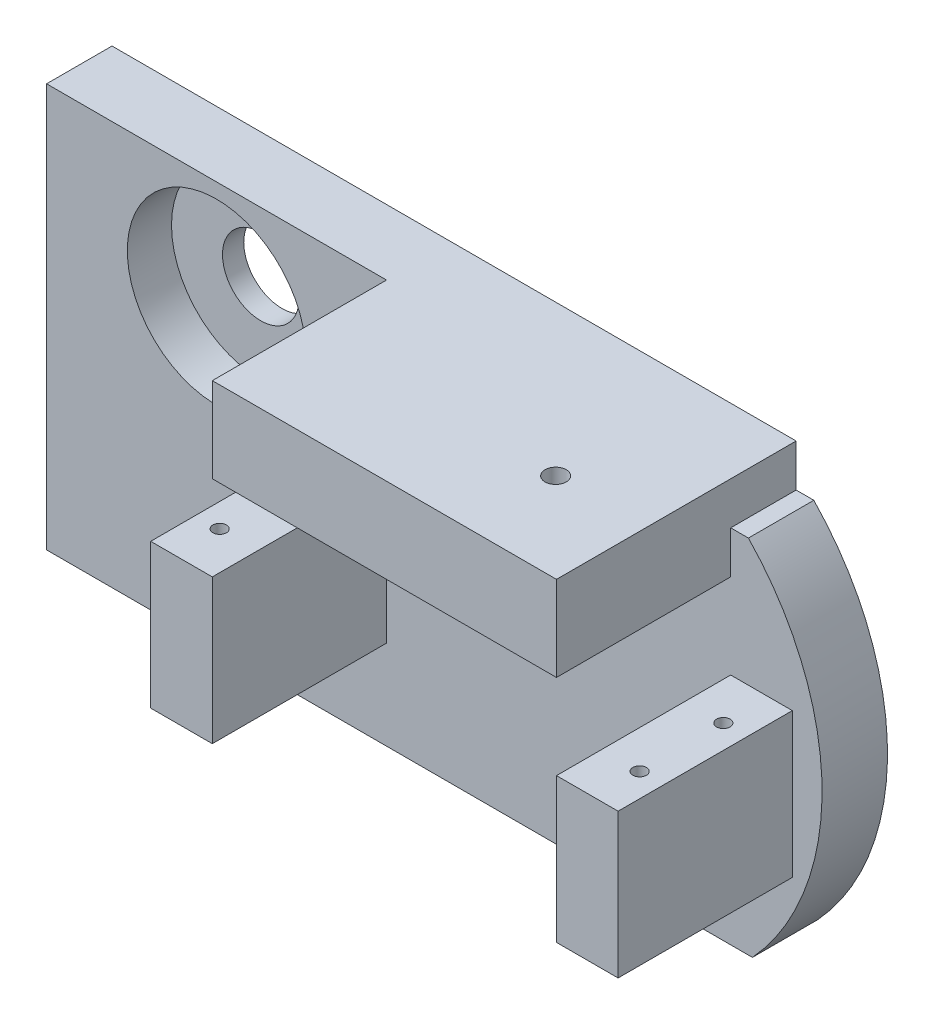
ISO-10303-21;
HEADER;
FILE_DESCRIPTION(('STEP AP214'),'2;1');
FILE_NAME('part.step','',(''),(''),'','','');
FILE_SCHEMA(('AUTOMOTIVE_DESIGN { 1 0 10303 214 1 1 1 1 }'));
ENDSEC;
DATA;
#1=APPLICATION_CONTEXT('core data for automotive mechanical design processes');
#2=APPLICATION_PROTOCOL_DEFINITION('international standard','automotive_design',2000,#1);
#3=PRODUCT_CONTEXT('',#1,'mechanical');
#4=PRODUCT('Part','Part','',(#3));
#5=PRODUCT_RELATED_PRODUCT_CATEGORY('part','',(#4));
#6=PRODUCT_DEFINITION_FORMATION('','',#4);
#7=PRODUCT_DEFINITION_CONTEXT('part definition',#1,'design');
#8=PRODUCT_DEFINITION('design','',#6,#7);
#9=PRODUCT_DEFINITION_SHAPE('','',#8);
#10=(LENGTH_UNIT() NAMED_UNIT(*) SI_UNIT(.MILLI.,.METRE.));
#11=(NAMED_UNIT(*) PLANE_ANGLE_UNIT() SI_UNIT($,.RADIAN.));
#12=(NAMED_UNIT(*) SI_UNIT($,.STERADIAN.) SOLID_ANGLE_UNIT());
#13=UNCERTAINTY_MEASURE_WITH_UNIT(LENGTH_MEASURE(1.E-05),#10,'distance_accuracy_value','');
#14=(GEOMETRIC_REPRESENTATION_CONTEXT(3) GLOBAL_UNCERTAINTY_ASSIGNED_CONTEXT((#13)) GLOBAL_UNIT_ASSIGNED_CONTEXT((#10,
#11,#12)) REPRESENTATION_CONTEXT('',''));
#15=CARTESIAN_POINT('',(0.,0.,0.));
#16=DIRECTION('',(0.,0.,1.));
#17=DIRECTION('',(1.,0.,0.));
#18=AXIS2_PLACEMENT_3D('',#15,#16,#17);
#19=CARTESIAN_POINT('',(-20.25,43.2442521140645,27.));
#20=DIRECTION('',(1.,0.,0.));
#21=DIRECTION('',(0.,0.,-1.));
#22=AXIS2_PLACEMENT_3D('',#19,#20,#21);
#23=PLANE('',#22);
#24=DIRECTION('',(0.,0.,1.));
#25=VECTOR('',#24,1.);
#26=CARTESIAN_POINT('',(-20.25,26.5,-1.2));
#27=LINE('',#26,#25);
#28=CARTESIAN_POINT('',(-20.25,26.5,6.5));
#29=VERTEX_POINT('',#28);
#30=CARTESIAN_POINT('',(-20.25,26.5,27.));
#31=VERTEX_POINT('',#30);
#32=EDGE_CURVE('E209',#29,#31,#27,.T.);
#33=ORIENTED_EDGE('',*,*,#32,.F.);
#34=DIRECTION('',(0.,-1.,0.));
#35=VECTOR('',#34,1.);
#36=CARTESIAN_POINT('',(-20.25,43.2442521140645,6.5));
#37=LINE('',#36,#35);
#38=CARTESIAN_POINT('',(-20.25,16.5,6.5));
#39=VERTEX_POINT('',#38);
#40=EDGE_CURVE('E62',#29,#39,#37,.T.);
#41=ORIENTED_EDGE('',*,*,#40,.T.);
#42=DIRECTION('',(0.,0.,1.));
#43=VECTOR('',#42,1.);
#44=CARTESIAN_POINT('',(-20.25,16.5,27.));
#45=LINE('',#44,#43);
#46=CARTESIAN_POINT('',(-20.25,16.5,27.));
#47=VERTEX_POINT('',#46);
#48=EDGE_CURVE('E248',#39,#47,#45,.T.);
#49=ORIENTED_EDGE('',*,*,#48,.T.);
#50=DIRECTION('',(0.,-1.,0.));
#51=VECTOR('',#50,1.);
#52=CARTESIAN_POINT('',(-20.25,43.2442521140645,27.));
#53=LINE('',#52,#51);
#54=EDGE_CURVE('E251',#31,#47,#53,.T.);
#55=ORIENTED_EDGE('',*,*,#54,.F.);
#56=EDGE_LOOP('',(#33,#41,#49,#55));
#57=FACE_BOUND('',#56,.T.);
#58=ADVANCED_FACE('F46',(#57),#23,.F.);
#59=CARTESIAN_POINT('',(-20.25,67.4360851344404,6.5));
#60=DIRECTION('',(0.,0.,-1.));
#61=DIRECTION('',(-1.,0.,0.));
#62=AXIS2_PLACEMENT_3D('',#59,#60,#61);
#63=PLANE('',#62);
#64=CARTESIAN_POINT('',(-40.25,14.25,6.5));
#65=DIRECTION('',(0.,0.,1.));
#66=DIRECTION('',(1.,0.,0.));
#67=AXIS2_PLACEMENT_3D('',#64,#65,#66);
#68=CIRCLE('',#67,10.5);
#69=CARTESIAN_POINT('',(-29.75,14.25,6.5));
#70=VERTEX_POINT('',#69);
#71=EDGE_CURVE('E341',#70,#70,#68,.T.);
#72=ORIENTED_EDGE('',*,*,#71,.F.);
#73=EDGE_LOOP('',(#72));
#74=FACE_BOUND('',#73,.T.);
#75=ORIENTED_EDGE('',*,*,#40,.F.);
#76=DIRECTION('',(-1.,0.,0.));
#77=VECTOR('',#76,1.);
#78=CARTESIAN_POINT('',(-20.25,26.5,6.5));
#79=LINE('',#78,#77);
#80=CARTESIAN_POINT('',(-60.25,26.5,6.5));
#81=VERTEX_POINT('',#80);
#82=EDGE_CURVE('E199',#29,#81,#79,.T.);
#83=ORIENTED_EDGE('',*,*,#82,.T.);
#84=DIRECTION('',(0.,-1.,0.));
#85=VECTOR('',#84,1.);
#86=CARTESIAN_POINT('',(-60.25,26.5,6.5));
#87=LINE('',#86,#85);
#88=CARTESIAN_POINT('',(-60.25,-21.,6.5));
#89=VERTEX_POINT('',#88);
#90=EDGE_CURVE('E193',#81,#89,#87,.T.);
#91=ORIENTED_EDGE('',*,*,#90,.T.);
#92=DIRECTION('',(-1.,0.,0.));
#93=VECTOR('',#92,1.);
#94=CARTESIAN_POINT('',(26.5027413784262,-21.,6.5));
#95=LINE('',#94,#93);
#96=CARTESIAN_POINT('',(22.8035085019828,-21.,6.5));
#97=VERTEX_POINT('',#96);
#98=EDGE_CURVE('E178',#97,#89,#95,.T.);
#99=ORIENTED_EDGE('',*,*,#98,.F.);
#100=CARTESIAN_POINT('',(0.,0.,6.50000000000001));
#101=DIRECTION('',(0.,0.,-1.));
#102=DIRECTION('',(-1.,0.,0.));
#103=AXIS2_PLACEMENT_3D('',#100,#101,#102);
#104=CIRCLE('',#103,31.);
#105=CARTESIAN_POINT('',(22.3327114341273,21.5,6.50000000000001));
#106=VERTEX_POINT('',#105);
#107=EDGE_CURVE('E240',#97,#106,#104,.F.);
#108=ORIENTED_EDGE('',*,*,#107,.T.);
#109=DIRECTION('',(1.,0.,0.));
#110=VECTOR('',#109,1.);
#111=CARTESIAN_POINT('',(-26.0407931939076,21.5,6.5));
#112=LINE('',#111,#110);
#113=CARTESIAN_POINT('',(20.25,21.5,6.5));
#114=VERTEX_POINT('',#113);
#115=EDGE_CURVE('E221',#114,#106,#112,.T.);
#116=ORIENTED_EDGE('',*,*,#115,.F.);
#117=DIRECTION('',(0.,-1.,0.));
#118=VECTOR('',#117,1.);
#119=CARTESIAN_POINT('',(20.25,43.2442521140645,6.5));
#120=LINE('',#119,#118);
#121=CARTESIAN_POINT('',(20.25,16.5,6.5));
#122=VERTEX_POINT('',#121);
#123=EDGE_CURVE('E257',#114,#122,#120,.T.);
#124=ORIENTED_EDGE('',*,*,#123,.T.);
#125=DIRECTION('',(-1.,0.,0.));
#126=VECTOR('',#125,1.);
#127=CARTESIAN_POINT('',(-20.25,16.5,6.5));
#128=LINE('',#127,#126);
#129=EDGE_CURVE('E301',#122,#39,#128,.T.);
#130=ORIENTED_EDGE('',*,*,#129,.T.);
#131=EDGE_LOOP('',(#75,#83,#91,#99,#108,#116,#124,#130));
#132=FACE_BOUND('',#131,.T.);
#133=DIRECTION('',(-1.,0.,0.));
#134=VECTOR('',#133,1.);
#135=CARTESIAN_POINT('',(50.3089894559141,6.50000000000001,6.5));
#136=LINE('',#135,#134);
#137=CARTESIAN_POINT('',(-20.25,6.5,6.5));
#138=VERTEX_POINT('',#137);
#139=CARTESIAN_POINT('',(-27.5,6.5,6.5));
#140=VERTEX_POINT('',#139);
#141=EDGE_CURVE('E262',#138,#140,#136,.T.);
#142=ORIENTED_EDGE('',*,*,#141,.F.);
#143=DIRECTION('',(0.,-1.,0.));
#144=VECTOR('',#143,1.);
#145=CARTESIAN_POINT('',(-20.25,67.4360851344404,6.5));
#146=LINE('',#145,#144);
#147=CARTESIAN_POINT('',(-20.25,-10.5,6.5));
#148=VERTEX_POINT('',#147);
#149=EDGE_CURVE('E298',#138,#148,#146,.T.);
#150=ORIENTED_EDGE('',*,*,#149,.T.);
#151=DIRECTION('',(-1.,0.,0.));
#152=VECTOR('',#151,1.);
#153=CARTESIAN_POINT('',(-27.5,-10.5,6.5));
#154=LINE('',#153,#152);
#155=CARTESIAN_POINT('',(-27.5,-10.5,6.5));
#156=VERTEX_POINT('',#155);
#157=EDGE_CURVE('E288',#148,#156,#154,.T.);
#158=ORIENTED_EDGE('',*,*,#157,.T.);
#159=DIRECTION('',(0.,1.,0.));
#160=VECTOR('',#159,1.);
#161=CARTESIAN_POINT('',(-27.5,21.5,6.5));
#162=LINE('',#161,#160);
#163=EDGE_CURVE('E245',#156,#140,#162,.T.);
#164=ORIENTED_EDGE('',*,*,#163,.T.);
#165=EDGE_LOOP('',(#142,#150,#158,#164));
#166=FACE_BOUND('',#165,.T.);
#167=CARTESIAN_POINT('',(27.5,6.50000000000001,6.5));
#168=VERTEX_POINT('',#167);
#169=CARTESIAN_POINT('',(20.25,6.50000000000001,6.5));
#170=VERTEX_POINT('',#169);
#171=EDGE_CURVE('E268',#168,#170,#136,.T.);
#172=ORIENTED_EDGE('',*,*,#171,.F.);
#173=DIRECTION('',(0.,-1.,0.));
#174=VECTOR('',#173,1.);
#175=CARTESIAN_POINT('',(27.5,21.5,6.5));
#176=LINE('',#175,#174);
#177=CARTESIAN_POINT('',(27.5,-10.5,6.5));
#178=VERTEX_POINT('',#177);
#179=EDGE_CURVE('E242',#168,#178,#176,.T.);
#180=ORIENTED_EDGE('',*,*,#179,.T.);
#181=CARTESIAN_POINT('',(20.25,-10.5,6.5));
#182=VERTEX_POINT('',#181);
#183=EDGE_CURVE('E289',#178,#182,#154,.T.);
#184=ORIENTED_EDGE('',*,*,#183,.T.);
#185=DIRECTION('',(0.,-1.,0.));
#186=VECTOR('',#185,1.);
#187=CARTESIAN_POINT('',(20.25,67.4360851344404,6.5));
#188=LINE('',#187,#186);
#189=EDGE_CURVE('E299',#170,#182,#188,.T.);
#190=ORIENTED_EDGE('',*,*,#189,.F.);
#191=EDGE_LOOP('',(#172,#180,#184,#190));
#192=FACE_BOUND('',#191,.T.);
#193=ADVANCED_FACE('F334',(#74,#132,#166,#192),#63,.F.);
#194=CARTESIAN_POINT('',(27.5,21.5,27.));
#195=DIRECTION('',(-1.,0.,0.));
#196=DIRECTION('',(0.,-1.,0.));
#197=AXIS2_PLACEMENT_3D('',#194,#195,#196);
#198=PLANE('',#197);
#199=ORIENTED_EDGE('',*,*,#179,.F.);
#200=DIRECTION('',(0.,0.,-1.));
#201=VECTOR('',#200,1.);
#202=CARTESIAN_POINT('',(27.5,6.50000000000001,6.5));
#203=LINE('',#202,#201);
#204=CARTESIAN_POINT('',(27.5,6.50000000000001,27.));
#205=VERTEX_POINT('',#204);
#206=EDGE_CURVE('E266',#205,#168,#203,.T.);
#207=ORIENTED_EDGE('',*,*,#206,.F.);
#208=DIRECTION('',(0.,1.,0.));
#209=VECTOR('',#208,1.);
#210=CARTESIAN_POINT('',(27.5,21.5,27.));
#211=LINE('',#210,#209);
#212=CARTESIAN_POINT('',(27.5,-10.5,27.));
#213=VERTEX_POINT('',#212);
#214=EDGE_CURVE('E304',#213,#205,#211,.T.);
#215=ORIENTED_EDGE('',*,*,#214,.F.);
#216=DIRECTION('',(0.,0.,-1.));
#217=VECTOR('',#216,1.);
#218=CARTESIAN_POINT('',(27.5,-10.5,27.));
#219=LINE('',#218,#217);
#220=EDGE_CURVE('E278',#213,#178,#219,.T.);
#221=ORIENTED_EDGE('',*,*,#220,.T.);
#222=EDGE_LOOP('',(#199,#207,#215,#221));
#223=FACE_BOUND('',#222,.T.);
#224=ADVANCED_FACE('F48',(#223),#198,.F.);
#225=CARTESIAN_POINT('',(-27.5,21.5,27.));
#226=DIRECTION('',(0.,-1.,0.));
#227=DIRECTION('',(0.,0.,-1.));
#228=AXIS2_PLACEMENT_3D('',#225,#226,#227);
#229=PLANE('',#228);
#230=DIRECTION('',(1.,0.,0.));
#231=VECTOR('',#230,1.);
#232=CARTESIAN_POINT('',(22.3327114341273,21.5,-1.2));
#233=LINE('',#232,#231);
#234=CARTESIAN_POINT('',(20.25,21.5,-1.2));
#235=VERTEX_POINT('',#234);
#236=CARTESIAN_POINT('',(22.3327114341273,21.5,-1.2));
#237=VERTEX_POINT('',#236);
#238=EDGE_CURVE('E219',#235,#237,#233,.T.);
#239=ORIENTED_EDGE('',*,*,#238,.F.);
#240=DIRECTION('',(0.,0.,1.));
#241=VECTOR('',#240,1.);
#242=CARTESIAN_POINT('',(20.25,21.5,-1.2));
#243=LINE('',#242,#241);
#244=EDGE_CURVE('E206',#235,#114,#243,.T.);
#245=ORIENTED_EDGE('',*,*,#244,.T.);
#246=ORIENTED_EDGE('',*,*,#115,.T.);
#247=DIRECTION('',(0.,0.,-1.));
#248=VECTOR('',#247,1.);
#249=CARTESIAN_POINT('',(22.3327114341273,21.5,94.1812408671319));
#250=LINE('',#249,#248);
#251=EDGE_CURVE('E55',#106,#237,#250,.T.);
#252=ORIENTED_EDGE('',*,*,#251,.T.);
#253=EDGE_LOOP('',(#239,#245,#246,#252));
#254=FACE_BOUND('',#253,.T.);
#255=ADVANCED_FACE('F329',(#254),#229,.F.);
#256=CARTESIAN_POINT('',(-27.5,21.5,27.));
#257=DIRECTION('',(1.,0.,0.));
#258=DIRECTION('',(0.,1.,0.));
#259=AXIS2_PLACEMENT_3D('',#256,#257,#258);
#260=PLANE('',#259);
#261=ORIENTED_EDGE('',*,*,#163,.F.);
#262=DIRECTION('',(0.,0.,1.));
#263=VECTOR('',#262,1.);
#264=CARTESIAN_POINT('',(-27.5,-10.5,27.));
#265=LINE('',#264,#263);
#266=CARTESIAN_POINT('',(-27.5,-10.5,27.));
#267=VERTEX_POINT('',#266);
#268=EDGE_CURVE('E285',#156,#267,#265,.T.);
#269=ORIENTED_EDGE('',*,*,#268,.T.);
#270=DIRECTION('',(0.,-1.,0.));
#271=VECTOR('',#270,1.);
#272=CARTESIAN_POINT('',(-27.5,21.5,27.));
#273=LINE('',#272,#271);
#274=CARTESIAN_POINT('',(-27.5,6.5,27.));
#275=VERTEX_POINT('',#274);
#276=EDGE_CURVE('E307',#275,#267,#273,.T.);
#277=ORIENTED_EDGE('',*,*,#276,.F.);
#278=DIRECTION('',(0.,0.,1.));
#279=VECTOR('',#278,1.);
#280=CARTESIAN_POINT('',(-27.5,6.5,6.5));
#281=LINE('',#280,#279);
#282=EDGE_CURVE('E254',#140,#275,#281,.T.);
#283=ORIENTED_EDGE('',*,*,#282,.F.);
#284=EDGE_LOOP('',(#261,#269,#277,#283));
#285=FACE_BOUND('',#284,.T.);
#286=ADVANCED_FACE('F371',(#285),#260,.F.);
#287=CARTESIAN_POINT('',(0.,0.,27.));
#288=DIRECTION('',(0.,0.,1.));
#289=DIRECTION('',(1.,0.,0.));
#290=AXIS2_PLACEMENT_3D('',#287,#288,#289);
#291=PLANE('',#290);
#292=ORIENTED_EDGE('',*,*,#54,.T.);
#293=DIRECTION('',(1.,0.,0.));
#294=VECTOR('',#293,1.);
#295=CARTESIAN_POINT('',(0.,16.5,27.));
#296=LINE('',#295,#294);
#297=CARTESIAN_POINT('',(20.25,16.5,27.));
#298=VERTEX_POINT('',#297);
#299=EDGE_CURVE('E309',#47,#298,#296,.T.);
#300=ORIENTED_EDGE('',*,*,#299,.T.);
#301=DIRECTION('',(0.,-1.,0.));
#302=VECTOR('',#301,1.);
#303=CARTESIAN_POINT('',(20.25,43.2442521140645,27.));
#304=LINE('',#303,#302);
#305=CARTESIAN_POINT('',(20.25,26.5,27.));
#306=VERTEX_POINT('',#305);
#307=EDGE_CURVE('E250',#306,#298,#304,.T.);
#308=ORIENTED_EDGE('',*,*,#307,.F.);
#309=DIRECTION('',(-1.,0.,0.));
#310=VECTOR('',#309,1.);
#311=CARTESIAN_POINT('',(-20.25,26.5,27.));
#312=LINE('',#311,#310);
#313=EDGE_CURVE('E202',#306,#31,#312,.T.);
#314=ORIENTED_EDGE('',*,*,#313,.T.);
#315=EDGE_LOOP('',(#292,#300,#308,#314));
#316=FACE_BOUND('',#315,.T.);
#317=ADVANCED_FACE('F370',(#316),#291,.T.);
#318=DIRECTION('',(-1.,0.,0.));
#319=VECTOR('',#318,1.);
#320=CARTESIAN_POINT('',(50.3089894559141,6.50000000000001,27.));
#321=LINE('',#320,#319);
#322=CARTESIAN_POINT('',(-20.25,6.5,27.));
#323=VERTEX_POINT('',#322);
#324=EDGE_CURVE('E267',#323,#275,#321,.T.);
#325=ORIENTED_EDGE('',*,*,#324,.T.);
#326=ORIENTED_EDGE('',*,*,#276,.T.);
#327=DIRECTION('',(1.,0.,0.));
#328=VECTOR('',#327,1.);
#329=CARTESIAN_POINT('',(-27.5,-10.5,27.));
#330=LINE('',#329,#328);
#331=CARTESIAN_POINT('',(-20.25,-10.5,27.));
#332=VERTEX_POINT('',#331);
#333=EDGE_CURVE('E282',#267,#332,#330,.T.);
#334=ORIENTED_EDGE('',*,*,#333,.T.);
#335=DIRECTION('',(0.,-1.,0.));
#336=VECTOR('',#335,1.);
#337=CARTESIAN_POINT('',(-20.25,0.,27.));
#338=LINE('',#337,#336);
#339=EDGE_CURVE('E315',#323,#332,#338,.T.);
#340=ORIENTED_EDGE('',*,*,#339,.F.);
#341=EDGE_LOOP('',(#325,#326,#334,#340));
#342=FACE_BOUND('',#341,.T.);
#343=ADVANCED_FACE('F368',(#342),#291,.T.);
#344=CARTESIAN_POINT('',(20.25,6.50000000000001,27.));
#345=VERTEX_POINT('',#344);
#346=EDGE_CURVE('E263',#205,#345,#321,.T.);
#347=ORIENTED_EDGE('',*,*,#346,.T.);
#348=DIRECTION('',(0.,1.,0.));
#349=VECTOR('',#348,1.);
#350=CARTESIAN_POINT('',(20.25,0.,27.));
#351=LINE('',#350,#349);
#352=CARTESIAN_POINT('',(20.25,-10.5,27.));
#353=VERTEX_POINT('',#352);
#354=EDGE_CURVE('E312',#353,#345,#351,.T.);
#355=ORIENTED_EDGE('',*,*,#354,.F.);
#356=EDGE_CURVE('E281',#353,#213,#330,.T.);
#357=ORIENTED_EDGE('',*,*,#356,.T.);
#358=ORIENTED_EDGE('',*,*,#214,.T.);
#359=EDGE_LOOP('',(#347,#355,#357,#358));
#360=FACE_BOUND('',#359,.T.);
#361=ADVANCED_FACE('F364',(#360),#291,.T.);
#362=CARTESIAN_POINT('',(-20.25,67.4360851344404,6.5));
#363=DIRECTION('',(-1.,0.,0.));
#364=DIRECTION('',(0.,0.,1.));
#365=AXIS2_PLACEMENT_3D('',#362,#363,#364);
#366=PLANE('',#365);
#367=ORIENTED_EDGE('',*,*,#149,.F.);
#368=DIRECTION('',(0.,0.,1.));
#369=VECTOR('',#368,1.);
#370=CARTESIAN_POINT('',(-20.25,6.5,6.5));
#371=LINE('',#370,#369);
#372=EDGE_CURVE('E275',#138,#323,#371,.T.);
#373=ORIENTED_EDGE('',*,*,#372,.T.);
#374=ORIENTED_EDGE('',*,*,#339,.T.);
#375=DIRECTION('',(0.,0.,1.));
#376=VECTOR('',#375,1.);
#377=CARTESIAN_POINT('',(-20.25,-10.5,6.5));
#378=LINE('',#377,#376);
#379=EDGE_CURVE('E295',#148,#332,#378,.T.);
#380=ORIENTED_EDGE('',*,*,#379,.F.);
#381=EDGE_LOOP('',(#367,#373,#374,#380));
#382=FACE_BOUND('',#381,.T.);
#383=ADVANCED_FACE('F361',(#382),#366,.F.);
#384=CARTESIAN_POINT('',(20.25,67.4360851344404,6.5));
#385=DIRECTION('',(1.,0.,0.));
#386=DIRECTION('',(0.,0.,-1.));
#387=AXIS2_PLACEMENT_3D('',#384,#385,#386);
#388=PLANE('',#387);
#389=ORIENTED_EDGE('',*,*,#354,.T.);
#390=DIRECTION('',(0.,0.,-1.));
#391=VECTOR('',#390,1.);
#392=CARTESIAN_POINT('',(20.25,6.50000000000001,6.5));
#393=LINE('',#392,#391);
#394=EDGE_CURVE('E272',#345,#170,#393,.T.);
#395=ORIENTED_EDGE('',*,*,#394,.T.);
#396=ORIENTED_EDGE('',*,*,#189,.T.);
#397=DIRECTION('',(0.,0.,-1.));
#398=VECTOR('',#397,1.);
#399=CARTESIAN_POINT('',(20.25,-10.5,6.5));
#400=LINE('',#399,#398);
#401=EDGE_CURVE('E292',#353,#182,#400,.T.);
#402=ORIENTED_EDGE('',*,*,#401,.F.);
#403=EDGE_LOOP('',(#389,#395,#396,#402));
#404=FACE_BOUND('',#403,.T.);
#405=ADVANCED_FACE('F359',(#404),#388,.F.);
#406=CARTESIAN_POINT('',(-27.5,16.5,27.));
#407=DIRECTION('',(0.,-1.,0.));
#408=DIRECTION('',(0.,0.,-1.));
#409=AXIS2_PLACEMENT_3D('',#406,#407,#408);
#410=PLANE('',#409);
#411=CARTESIAN_POINT('',(9.65,16.5,16.5));
#412=DIRECTION('',(0.,-1.,0.));
#413=DIRECTION('',(0.,0.,-1.));
#414=AXIS2_PLACEMENT_3D('',#411,#412,#413);
#415=CIRCLE('',#414,1.24999999999999);
#416=CARTESIAN_POINT('',(9.65,16.5,15.25));
#417=VERTEX_POINT('',#416);
#418=EDGE_CURVE('E198',#417,#417,#415,.T.);
#419=ORIENTED_EDGE('',*,*,#418,.F.);
#420=EDGE_LOOP('',(#419));
#421=FACE_BOUND('',#420,.T.);
#422=ORIENTED_EDGE('',*,*,#48,.F.);
#423=ORIENTED_EDGE('',*,*,#129,.F.);
#424=DIRECTION('',(0.,0.,-1.));
#425=VECTOR('',#424,1.);
#426=CARTESIAN_POINT('',(20.25,16.5,27.));
#427=LINE('',#426,#425);
#428=EDGE_CURVE('E247',#298,#122,#427,.T.);
#429=ORIENTED_EDGE('',*,*,#428,.F.);
#430=ORIENTED_EDGE('',*,*,#299,.F.);
#431=EDGE_LOOP('',(#422,#423,#429,#430));
#432=FACE_BOUND('',#431,.T.);
#433=ADVANCED_FACE('F412',(#421,#432),#410,.T.);
#434=CARTESIAN_POINT('',(-27.5,-10.5,27.));
#435=DIRECTION('',(0.,-1.,0.));
#436=DIRECTION('',(0.,0.,-1.));
#437=AXIS2_PLACEMENT_3D('',#434,#435,#436);
#438=PLANE('',#437);
#439=CARTESIAN_POINT('',(24.71,-10.5,21.675));
#440=DIRECTION('',(0.,-1.,0.));
#441=DIRECTION('',(0.,0.,-1.));
#442=AXIS2_PLACEMENT_3D('',#439,#440,#441);
#443=CIRCLE('',#442,0.799999999999995);
#444=CARTESIAN_POINT('',(24.71,-10.5,20.875));
#445=VERTEX_POINT('',#444);
#446=EDGE_CURVE('E232',#445,#445,#443,.T.);
#447=ORIENTED_EDGE('',*,*,#446,.F.);
#448=EDGE_LOOP('',(#447));
#449=FACE_BOUND('',#448,.T.);
#450=CARTESIAN_POINT('',(24.71,-10.5,11.825));
#451=DIRECTION('',(0.,-1.,0.));
#452=DIRECTION('',(0.,0.,-1.));
#453=AXIS2_PLACEMENT_3D('',#450,#451,#452);
#454=CIRCLE('',#453,0.799999999999995);
#455=CARTESIAN_POINT('',(24.71,-10.5,11.025));
#456=VERTEX_POINT('',#455);
#457=EDGE_CURVE('E236',#456,#456,#454,.T.);
#458=ORIENTED_EDGE('',*,*,#457,.F.);
#459=EDGE_LOOP('',(#458));
#460=FACE_BOUND('',#459,.T.);
#461=ORIENTED_EDGE('',*,*,#401,.T.);
#462=ORIENTED_EDGE('',*,*,#183,.F.);
#463=ORIENTED_EDGE('',*,*,#220,.F.);
#464=ORIENTED_EDGE('',*,*,#356,.F.);
#465=EDGE_LOOP('',(#461,#462,#463,#464));
#466=FACE_BOUND('',#465,.T.);
#467=ADVANCED_FACE('F419',(#449,#460,#466),#438,.T.);
#468=CARTESIAN_POINT('',(-24.71,-10.5,21.675));
#469=DIRECTION('',(0.,-1.,0.));
#470=DIRECTION('',(0.,0.,-1.));
#471=AXIS2_PLACEMENT_3D('',#468,#469,#470);
#472=CIRCLE('',#471,0.799999999999995);
#473=CARTESIAN_POINT('',(-24.71,-10.5,20.875));
#474=VERTEX_POINT('',#473);
#475=EDGE_CURVE('E224',#474,#474,#472,.T.);
#476=ORIENTED_EDGE('',*,*,#475,.F.);
#477=EDGE_LOOP('',(#476));
#478=FACE_BOUND('',#477,.T.);
#479=CARTESIAN_POINT('',(-24.71,-10.5,11.825));
#480=DIRECTION('',(0.,-1.,0.));
#481=DIRECTION('',(0.,0.,-1.));
#482=AXIS2_PLACEMENT_3D('',#479,#480,#481);
#483=CIRCLE('',#482,0.799999999999995);
#484=CARTESIAN_POINT('',(-24.71,-10.5,11.025));
#485=VERTEX_POINT('',#484);
#486=EDGE_CURVE('E228',#485,#485,#483,.T.);
#487=ORIENTED_EDGE('',*,*,#486,.F.);
#488=EDGE_LOOP('',(#487));
#489=FACE_BOUND('',#488,.T.);
#490=ORIENTED_EDGE('',*,*,#379,.T.);
#491=ORIENTED_EDGE('',*,*,#333,.F.);
#492=ORIENTED_EDGE('',*,*,#268,.F.);
#493=ORIENTED_EDGE('',*,*,#157,.F.);
#494=EDGE_LOOP('',(#490,#491,#492,#493));
#495=FACE_BOUND('',#494,.T.);
#496=ADVANCED_FACE('F427',(#478,#489,#495),#438,.T.);
#497=CARTESIAN_POINT('',(50.3089894559141,6.50000000000001,6.5));
#498=DIRECTION('',(0.,-1.,0.));
#499=DIRECTION('',(1.,0.,0.));
#500=AXIS2_PLACEMENT_3D('',#497,#498,#499);
#501=PLANE('',#500);
#502=CARTESIAN_POINT('',(-24.71,6.5,21.675));
#503=DIRECTION('',(0.,-1.,0.));
#504=DIRECTION('',(1.,0.,0.));
#505=AXIS2_PLACEMENT_3D('',#502,#503,#504);
#506=CIRCLE('',#505,0.799999999999993);
#507=CARTESIAN_POINT('',(-23.91,6.5,21.675));
#508=VERTEX_POINT('',#507);
#509=EDGE_CURVE('E227',#508,#508,#506,.T.);
#510=ORIENTED_EDGE('',*,*,#509,.T.);
#511=EDGE_LOOP('',(#510));
#512=FACE_BOUND('',#511,.T.);
#513=CARTESIAN_POINT('',(-24.71,6.5,11.825));
#514=DIRECTION('',(0.,-1.,0.));
#515=DIRECTION('',(1.,0.,0.));
#516=AXIS2_PLACEMENT_3D('',#513,#514,#515);
#517=CIRCLE('',#516,0.799999999999993);
#518=CARTESIAN_POINT('',(-23.91,6.5,11.825));
#519=VERTEX_POINT('',#518);
#520=EDGE_CURVE('E231',#519,#519,#517,.T.);
#521=ORIENTED_EDGE('',*,*,#520,.T.);
#522=EDGE_LOOP('',(#521));
#523=FACE_BOUND('',#522,.T.);
#524=ORIENTED_EDGE('',*,*,#141,.T.);
#525=ORIENTED_EDGE('',*,*,#282,.T.);
#526=ORIENTED_EDGE('',*,*,#324,.F.);
#527=ORIENTED_EDGE('',*,*,#372,.F.);
#528=EDGE_LOOP('',(#524,#525,#526,#527));
#529=FACE_BOUND('',#528,.T.);
#530=ADVANCED_FACE('F437',(#512,#523,#529),#501,.F.);
#531=CARTESIAN_POINT('',(24.71,6.50000000000001,21.675));
#532=DIRECTION('',(0.,-1.,0.));
#533=DIRECTION('',(1.,0.,0.));
#534=AXIS2_PLACEMENT_3D('',#531,#532,#533);
#535=CIRCLE('',#534,0.799999999999993);
#536=CARTESIAN_POINT('',(25.51,6.50000000000001,21.675));
#537=VERTEX_POINT('',#536);
#538=EDGE_CURVE('E235',#537,#537,#535,.T.);
#539=ORIENTED_EDGE('',*,*,#538,.T.);
#540=EDGE_LOOP('',(#539));
#541=FACE_BOUND('',#540,.T.);
#542=CARTESIAN_POINT('',(24.71,6.50000000000001,11.825));
#543=DIRECTION('',(0.,-1.,0.));
#544=DIRECTION('',(1.,0.,0.));
#545=AXIS2_PLACEMENT_3D('',#542,#543,#544);
#546=CIRCLE('',#545,0.799999999999993);
#547=CARTESIAN_POINT('',(25.51,6.50000000000001,11.825));
#548=VERTEX_POINT('',#547);
#549=EDGE_CURVE('E239',#548,#548,#546,.T.);
#550=ORIENTED_EDGE('',*,*,#549,.T.);
#551=EDGE_LOOP('',(#550));
#552=FACE_BOUND('',#551,.T.);
#553=ORIENTED_EDGE('',*,*,#346,.F.);
#554=ORIENTED_EDGE('',*,*,#206,.T.);
#555=ORIENTED_EDGE('',*,*,#171,.T.);
#556=ORIENTED_EDGE('',*,*,#394,.F.);
#557=EDGE_LOOP('',(#553,#554,#555,#556));
#558=FACE_BOUND('',#557,.T.);
#559=ADVANCED_FACE('F446',(#541,#552,#558),#501,.F.);
#560=CARTESIAN_POINT('',(20.25,43.2442521140645,27.));
#561=DIRECTION('',(-1.,0.,0.));
#562=DIRECTION('',(0.,0.,1.));
#563=AXIS2_PLACEMENT_3D('',#560,#561,#562);
#564=PLANE('',#563);
#565=ORIENTED_EDGE('',*,*,#123,.F.);
#566=ORIENTED_EDGE('',*,*,#244,.F.);
#567=DIRECTION('',(0.,1.,0.));
#568=VECTOR('',#567,1.);
#569=CARTESIAN_POINT('',(20.25,21.5,-1.2));
#570=LINE('',#569,#568);
#571=CARTESIAN_POINT('',(20.25,26.5,-1.2));
#572=VERTEX_POINT('',#571);
#573=EDGE_CURVE('E70',#235,#572,#570,.T.);
#574=ORIENTED_EDGE('',*,*,#573,.T.);
#575=DIRECTION('',(0.,0.,1.));
#576=VECTOR('',#575,1.);
#577=CARTESIAN_POINT('',(20.25,26.5,-1.2));
#578=LINE('',#577,#576);
#579=EDGE_CURVE('E211',#572,#306,#578,.T.);
#580=ORIENTED_EDGE('',*,*,#579,.T.);
#581=ORIENTED_EDGE('',*,*,#307,.T.);
#582=ORIENTED_EDGE('',*,*,#428,.T.);
#583=EDGE_LOOP('',(#565,#566,#574,#580,#581,#582));
#584=FACE_BOUND('',#583,.T.);
#585=ADVANCED_FACE('F455',(#584),#564,.F.);
#586=CARTESIAN_POINT('',(0.,0.,94.1812408671319));
#587=DIRECTION('',(0.,0.,-1.));
#588=DIRECTION('',(-1.,0.,0.));
#589=AXIS2_PLACEMENT_3D('',#586,#587,#588);
#590=CYLINDRICAL_SURFACE('',#589,31.);
#591=DIRECTION('',(0.,0.,-1.));
#592=VECTOR('',#591,1.);
#593=CARTESIAN_POINT('',(22.8035085019828,-21.,94.1812408671319));
#594=LINE('',#593,#592);
#595=CARTESIAN_POINT('',(22.8035085019828,-21.,-1.2));
#596=VERTEX_POINT('',#595);
#597=EDGE_CURVE('E216',#596,#97,#594,.F.);
#598=ORIENTED_EDGE('',*,*,#597,.F.);
#599=CARTESIAN_POINT('',(0.,0.,-1.2));
#600=DIRECTION('',(0.,0.,-1.));
#601=DIRECTION('',(-1.,0.,0.));
#602=AXIS2_PLACEMENT_3D('',#599,#600,#601);
#603=CIRCLE('',#602,31.);
#604=EDGE_CURVE('E171',#237,#596,#603,.T.);
#605=ORIENTED_EDGE('',*,*,#604,.F.);
#606=ORIENTED_EDGE('',*,*,#251,.F.);
#607=ORIENTED_EDGE('',*,*,#107,.F.);
#608=EDGE_LOOP('',(#598,#605,#606,#607));
#609=FACE_BOUND('',#608,.T.);
#610=ADVANCED_FACE('F333',(#609),#590,.T.);
#611=CARTESIAN_POINT('',(24.71,-10.5,11.825));
#612=DIRECTION('',(0.,-1.,0.));
#613=DIRECTION('',(0.,0.,-1.));
#614=AXIS2_PLACEMENT_3D('',#611,#612,#613);
#615=CYLINDRICAL_SURFACE('',#614,0.799999999999993);
#616=ORIENTED_EDGE('',*,*,#457,.T.);
#617=EDGE_LOOP('',(#616));
#618=FACE_BOUND('',#617,.T.);
#619=ORIENTED_EDGE('',*,*,#549,.F.);
#620=EDGE_LOOP('',(#619));
#621=FACE_BOUND('',#620,.T.);
#622=ADVANCED_FACE('F468',(#618,#621),#615,.F.);
#623=CARTESIAN_POINT('',(24.71,-10.5,21.675));
#624=DIRECTION('',(0.,-1.,0.));
#625=DIRECTION('',(0.,0.,-1.));
#626=AXIS2_PLACEMENT_3D('',#623,#624,#625);
#627=CYLINDRICAL_SURFACE('',#626,0.799999999999993);
#628=ORIENTED_EDGE('',*,*,#446,.T.);
#629=EDGE_LOOP('',(#628));
#630=FACE_BOUND('',#629,.T.);
#631=ORIENTED_EDGE('',*,*,#538,.F.);
#632=EDGE_LOOP('',(#631));
#633=FACE_BOUND('',#632,.T.);
#634=ADVANCED_FACE('F475',(#630,#633),#627,.F.);
#635=CARTESIAN_POINT('',(-24.71,-10.5,11.825));
#636=DIRECTION('',(0.,-1.,0.));
#637=DIRECTION('',(0.,0.,-1.));
#638=AXIS2_PLACEMENT_3D('',#635,#636,#637);
#639=CYLINDRICAL_SURFACE('',#638,0.799999999999993);
#640=ORIENTED_EDGE('',*,*,#486,.T.);
#641=EDGE_LOOP('',(#640));
#642=FACE_BOUND('',#641,.T.);
#643=ORIENTED_EDGE('',*,*,#520,.F.);
#644=EDGE_LOOP('',(#643));
#645=FACE_BOUND('',#644,.T.);
#646=ADVANCED_FACE('F483',(#642,#645),#639,.F.);
#647=CARTESIAN_POINT('',(-24.71,-10.5,21.675));
#648=DIRECTION('',(0.,-1.,0.));
#649=DIRECTION('',(0.,0.,-1.));
#650=AXIS2_PLACEMENT_3D('',#647,#648,#649);
#651=CYLINDRICAL_SURFACE('',#650,0.799999999999993);
#652=ORIENTED_EDGE('',*,*,#475,.T.);
#653=EDGE_LOOP('',(#652));
#654=FACE_BOUND('',#653,.T.);
#655=ORIENTED_EDGE('',*,*,#509,.F.);
#656=EDGE_LOOP('',(#655));
#657=FACE_BOUND('',#656,.T.);
#658=ADVANCED_FACE('F490',(#654,#657),#651,.F.);
#659=CARTESIAN_POINT('',(0.,0.,-1.2));
#660=DIRECTION('',(0.,0.,-1.));
#661=DIRECTION('',(-1.,0.,0.));
#662=AXIS2_PLACEMENT_3D('',#659,#660,#661);
#663=PLANE('',#662);
#664=ORIENTED_EDGE('',*,*,#604,.T.);
#665=DIRECTION('',(1.,0.,0.));
#666=VECTOR('',#665,1.);
#667=CARTESIAN_POINT('',(0.,-21.,-1.2));
#668=LINE('',#667,#666);
#669=CARTESIAN_POINT('',(-60.25,-21.,-1.2));
#670=VERTEX_POINT('',#669);
#671=EDGE_CURVE('E13',#670,#596,#668,.T.);
#672=ORIENTED_EDGE('',*,*,#671,.F.);
#673=DIRECTION('',(0.,1.,0.));
#674=VECTOR('',#673,1.);
#675=CARTESIAN_POINT('',(-60.25,26.5,-1.2));
#676=LINE('',#675,#674);
#677=CARTESIAN_POINT('',(-60.25,26.5,-1.2));
#678=VERTEX_POINT('',#677);
#679=EDGE_CURVE('E169',#670,#678,#676,.T.);
#680=ORIENTED_EDGE('',*,*,#679,.T.);
#681=DIRECTION('',(-1.,0.,0.));
#682=VECTOR('',#681,1.);
#683=CARTESIAN_POINT('',(-20.25,26.5,-1.2));
#684=LINE('',#683,#682);
#685=EDGE_CURVE('E204',#572,#678,#684,.T.);
#686=ORIENTED_EDGE('',*,*,#685,.F.);
#687=ORIENTED_EDGE('',*,*,#573,.F.);
#688=ORIENTED_EDGE('',*,*,#238,.T.);
#689=EDGE_LOOP('',(#664,#672,#680,#686,#687,#688));
#690=FACE_BOUND('',#689,.T.);
#691=CARTESIAN_POINT('',(-40.25,14.25,-1.2));
#692=DIRECTION('',(0.,0.,-1.));
#693=DIRECTION('',(-1.,0.,0.));
#694=AXIS2_PLACEMENT_3D('',#691,#692,#693);
#695=CIRCLE('',#694,4.5);
#696=CARTESIAN_POINT('',(-44.75,14.25,-1.2));
#697=VERTEX_POINT('',#696);
#698=EDGE_CURVE('E187',#697,#697,#695,.T.);
#699=ORIENTED_EDGE('',*,*,#698,.F.);
#700=EDGE_LOOP('',(#699));
#701=FACE_BOUND('',#700,.T.);
#702=ADVANCED_FACE('F166',(#690,#701),#663,.T.);
#703=CARTESIAN_POINT('',(26.5027413784262,-21.,-55.1405339451416));
#704=DIRECTION('',(0.,1.,0.));
#705=DIRECTION('',(-1.,0.,0.));
#706=AXIS2_PLACEMENT_3D('',#703,#704,#705);
#707=PLANE('',#706);
#708=ORIENTED_EDGE('',*,*,#98,.T.);
#709=DIRECTION('',(0.,0.,-1.));
#710=VECTOR('',#709,1.);
#711=CARTESIAN_POINT('',(-60.25,-21.,68.5987117418711));
#712=LINE('',#711,#710);
#713=EDGE_CURVE('E175',#89,#670,#712,.T.);
#714=ORIENTED_EDGE('',*,*,#713,.T.);
#715=ORIENTED_EDGE('',*,*,#671,.T.);
#716=ORIENTED_EDGE('',*,*,#597,.T.);
#717=EDGE_LOOP('',(#708,#714,#715,#716));
#718=FACE_BOUND('',#717,.T.);
#719=ADVANCED_FACE('F176',(#718),#707,.F.);
#720=CARTESIAN_POINT('',(0.,26.5,15.8768229827015));
#721=DIRECTION('',(0.,1.,0.));
#722=DIRECTION('',(0.,0.,1.));
#723=AXIS2_PLACEMENT_3D('',#720,#721,#722);
#724=PLANE('',#723);
#725=CARTESIAN_POINT('',(9.65,26.5,16.5));
#726=DIRECTION('',(0.,1.,0.));
#727=DIRECTION('',(0.,0.,1.));
#728=AXIS2_PLACEMENT_3D('',#725,#726,#727);
#729=CIRCLE('',#728,1.24999999999999);
#730=CARTESIAN_POINT('',(9.65,26.5,17.75));
#731=VERTEX_POINT('',#730);
#732=EDGE_CURVE('E195',#731,#731,#729,.T.);
#733=ORIENTED_EDGE('',*,*,#732,.F.);
#734=EDGE_LOOP('',(#733));
#735=FACE_BOUND('',#734,.T.);
#736=ORIENTED_EDGE('',*,*,#313,.F.);
#737=ORIENTED_EDGE('',*,*,#579,.F.);
#738=ORIENTED_EDGE('',*,*,#685,.T.);
#739=DIRECTION('',(0.,0.,-1.));
#740=VECTOR('',#739,1.);
#741=CARTESIAN_POINT('',(-60.25,26.5,68.5987117418711));
#742=LINE('',#741,#740);
#743=EDGE_CURVE('E182',#81,#678,#742,.T.);
#744=ORIENTED_EDGE('',*,*,#743,.F.);
#745=ORIENTED_EDGE('',*,*,#82,.F.);
#746=ORIENTED_EDGE('',*,*,#32,.T.);
#747=EDGE_LOOP('',(#736,#737,#738,#744,#745,#746));
#748=FACE_BOUND('',#747,.T.);
#749=ADVANCED_FACE('F510',(#735,#748),#724,.T.);
#750=CARTESIAN_POINT('',(9.65,26.5,16.5));
#751=DIRECTION('',(0.,1.,0.));
#752=DIRECTION('',(0.,0.,1.));
#753=AXIS2_PLACEMENT_3D('',#750,#751,#752);
#754=CYLINDRICAL_SURFACE('',#753,1.24999999999999);
#755=ORIENTED_EDGE('',*,*,#418,.T.);
#756=EDGE_LOOP('',(#755));
#757=FACE_BOUND('',#756,.T.);
#758=ORIENTED_EDGE('',*,*,#732,.T.);
#759=EDGE_LOOP('',(#758));
#760=FACE_BOUND('',#759,.T.);
#761=ADVANCED_FACE('F518',(#757,#760),#754,.F.);
#762=CARTESIAN_POINT('',(-60.25,26.5,68.5987117418711));
#763=DIRECTION('',(-1.,0.,0.));
#764=DIRECTION('',(0.,-1.,0.));
#765=AXIS2_PLACEMENT_3D('',#762,#763,#764);
#766=PLANE('',#765);
#767=ORIENTED_EDGE('',*,*,#90,.F.);
#768=ORIENTED_EDGE('',*,*,#743,.T.);
#769=ORIENTED_EDGE('',*,*,#679,.F.);
#770=ORIENTED_EDGE('',*,*,#713,.F.);
#771=EDGE_LOOP('',(#767,#768,#769,#770));
#772=FACE_BOUND('',#771,.T.);
#773=ADVANCED_FACE('F185',(#772),#766,.T.);
#774=CARTESIAN_POINT('',(-40.25,14.25,68.5987117418711));
#775=DIRECTION('',(0.,0.,-1.));
#776=DIRECTION('',(-1.,0.,0.));
#777=AXIS2_PLACEMENT_3D('',#774,#775,#776);
#778=CYLINDRICAL_SURFACE('',#777,4.5);
#779=CARTESIAN_POINT('',(-40.25,14.25,1.3));
#780=DIRECTION('',(0.,0.,-1.));
#781=DIRECTION('',(-1.,0.,0.));
#782=AXIS2_PLACEMENT_3D('',#779,#780,#781);
#783=CIRCLE('',#782,4.5);
#784=CARTESIAN_POINT('',(-44.75,14.25,1.3));
#785=VERTEX_POINT('',#784);
#786=EDGE_CURVE('E50',#785,#785,#783,.F.);
#787=ORIENTED_EDGE('',*,*,#786,.T.);
#788=EDGE_LOOP('',(#787));
#789=FACE_BOUND('',#788,.T.);
#790=ORIENTED_EDGE('',*,*,#698,.T.);
#791=EDGE_LOOP('',(#790));
#792=FACE_BOUND('',#791,.T.);
#793=ADVANCED_FACE('F533',(#789,#792),#778,.F.);
#794=CARTESIAN_POINT('',(0.,0.,1.3));
#795=DIRECTION('',(0.,0.,-1.));
#796=DIRECTION('',(-1.,0.,0.));
#797=AXIS2_PLACEMENT_3D('',#794,#795,#796);
#798=PLANE('',#797);
#799=CARTESIAN_POINT('',(-40.25,14.25,1.3));
#800=DIRECTION('',(0.,0.,-1.));
#801=DIRECTION('',(-1.,0.,0.));
#802=AXIS2_PLACEMENT_3D('',#799,#800,#801);
#803=CIRCLE('',#802,10.5);
#804=CARTESIAN_POINT('',(-50.75,14.25,1.3));
#805=VERTEX_POINT('',#804);
#806=EDGE_CURVE('E338',#805,#805,#803,.F.);
#807=ORIENTED_EDGE('',*,*,#806,.T.);
#808=EDGE_LOOP('',(#807));
#809=FACE_BOUND('',#808,.T.);
#810=ORIENTED_EDGE('',*,*,#786,.F.);
#811=EDGE_LOOP('',(#810));
#812=FACE_BOUND('',#811,.T.);
#813=ADVANCED_FACE('F540',(#809,#812),#798,.F.);
#814=CARTESIAN_POINT('',(-40.25,14.25,-30.898484809835));
#815=DIRECTION('',(0.,0.,1.));
#816=DIRECTION('',(1.,0.,0.));
#817=AXIS2_PLACEMENT_3D('',#814,#815,#816);
#818=CYLINDRICAL_SURFACE('',#817,10.5);
#819=ORIENTED_EDGE('',*,*,#71,.T.);
#820=EDGE_LOOP('',(#819));
#821=FACE_BOUND('',#820,.T.);
#822=ORIENTED_EDGE('',*,*,#806,.F.);
#823=EDGE_LOOP('',(#822));
#824=FACE_BOUND('',#823,.T.);
#825=ADVANCED_FACE('F345',(#821,#824),#818,.F.);
#826=CLOSED_SHELL('',(#58,#193,#224,#255,#286,#317,#343,#361,#383,#405,#433,#467,#496,#530,#559,
#585,#610,#622,#634,#646,#658,#702,#719,#749,#761,#773,#793,#813,#825));
#827=MANIFOLD_SOLID_BREP('B2',#826);
#828=ADVANCED_BREP_SHAPE_REPRESENTATION('',(#18,#827),#14);
#829=SHAPE_DEFINITION_REPRESENTATION(#9,#828);
ENDSEC;
END-ISO-10303-21;
